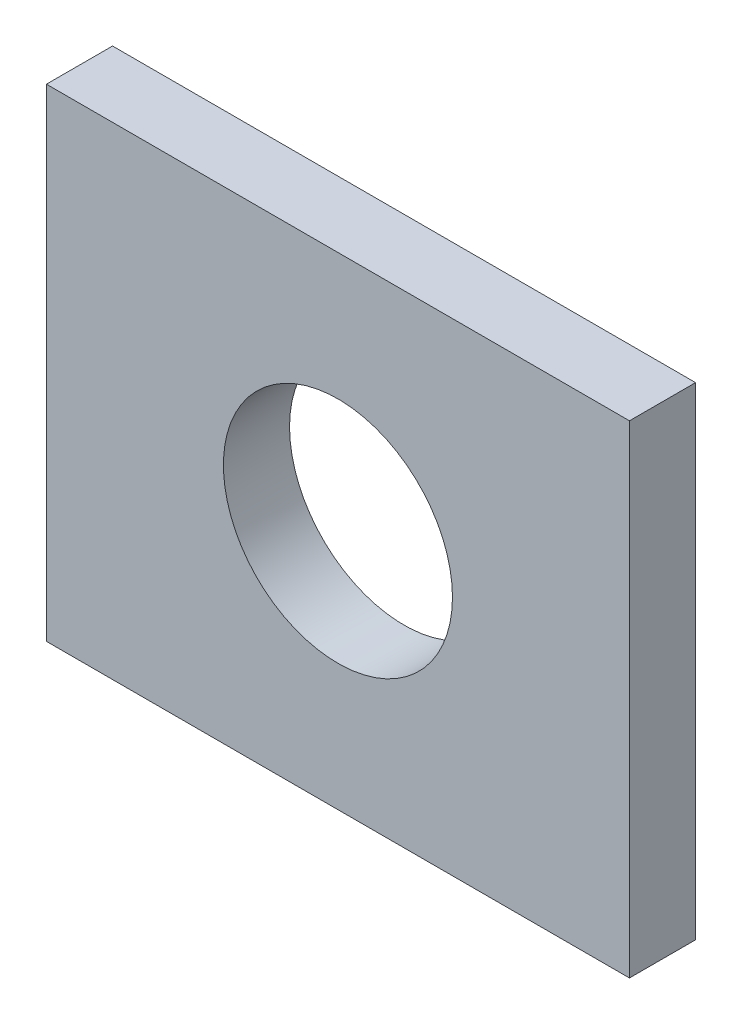
ISO-10303-21;
HEADER;
FILE_DESCRIPTION(('STEP AP214'),'2;1');
FILE_NAME('part.step','',(''),(''),'','','');
FILE_SCHEMA(('AUTOMOTIVE_DESIGN { 1 0 10303 214 1 1 1 1 }'));
ENDSEC;
DATA;
#1=APPLICATION_CONTEXT('core data for automotive mechanical design processes');
#2=APPLICATION_PROTOCOL_DEFINITION('international standard','automotive_design',2000,#1);
#3=PRODUCT_CONTEXT('',#1,'mechanical');
#4=PRODUCT('Part','Part','',(#3));
#5=PRODUCT_RELATED_PRODUCT_CATEGORY('part','',(#4));
#6=PRODUCT_DEFINITION_FORMATION('','',#4);
#7=PRODUCT_DEFINITION_CONTEXT('part definition',#1,'design');
#8=PRODUCT_DEFINITION('design','',#6,#7);
#9=PRODUCT_DEFINITION_SHAPE('','',#8);
#10=(LENGTH_UNIT() NAMED_UNIT(*) SI_UNIT(.MILLI.,.METRE.));
#11=(NAMED_UNIT(*) PLANE_ANGLE_UNIT() SI_UNIT($,.RADIAN.));
#12=(NAMED_UNIT(*) SI_UNIT($,.STERADIAN.) SOLID_ANGLE_UNIT());
#13=UNCERTAINTY_MEASURE_WITH_UNIT(LENGTH_MEASURE(1.E-05),#10,'distance_accuracy_value','');
#14=(GEOMETRIC_REPRESENTATION_CONTEXT(3) GLOBAL_UNCERTAINTY_ASSIGNED_CONTEXT((#13)) GLOBAL_UNIT_ASSIGNED_CONTEXT((#10,
#11,#12)) REPRESENTATION_CONTEXT('',''));
#15=CARTESIAN_POINT('',(0.,0.,0.));
#16=DIRECTION('',(0.,0.,1.));
#17=DIRECTION('',(1.,0.,0.));
#18=AXIS2_PLACEMENT_3D('',#15,#16,#17);
#19=CARTESIAN_POINT('',(-6.35,-6.35,6.35));
#20=DIRECTION('',(1.,0.,0.));
#21=DIRECTION('',(0.,0.,-1.));
#22=AXIS2_PLACEMENT_3D('',#19,#20,#21);
#23=PLANE('',#22);
#24=DIRECTION('',(0.,-1.,0.));
#25=VECTOR('',#24,1.);
#26=CARTESIAN_POINT('',(-6.35,-6.35,0.));
#27=LINE('',#26,#25);
#28=CARTESIAN_POINT('',(-6.35,40.,0.));
#29=VERTEX_POINT('',#28);
#30=CARTESIAN_POINT('',(-6.35,-6.35,0.));
#31=VERTEX_POINT('',#30);
#32=EDGE_CURVE('E96',#29,#31,#27,.T.);
#33=ORIENTED_EDGE('',*,*,#32,.T.);
#34=DIRECTION('',(0.,0.,-1.));
#35=VECTOR('',#34,1.);
#36=CARTESIAN_POINT('',(-6.35,-6.35,6.35));
#37=LINE('',#36,#35);
#38=CARTESIAN_POINT('',(-6.35,-6.35,6.35));
#39=VERTEX_POINT('',#38);
#40=EDGE_CURVE('E11',#39,#31,#37,.T.);
#41=ORIENTED_EDGE('',*,*,#40,.F.);
#42=DIRECTION('',(0.,-1.,0.));
#43=VECTOR('',#42,1.);
#44=CARTESIAN_POINT('',(-6.35,-6.35,6.35));
#45=LINE('',#44,#43);
#46=CARTESIAN_POINT('',(-6.35,40.,6.35));
#47=VERTEX_POINT('',#46);
#48=EDGE_CURVE('E84',#47,#39,#45,.T.);
#49=ORIENTED_EDGE('',*,*,#48,.F.);
#50=DIRECTION('',(0.,0.,-1.));
#51=VECTOR('',#50,1.);
#52=CARTESIAN_POINT('',(-6.35,40.,6.35));
#53=LINE('',#52,#51);
#54=EDGE_CURVE('E92',#47,#29,#53,.T.);
#55=ORIENTED_EDGE('',*,*,#54,.T.);
#56=EDGE_LOOP('',(#33,#41,#49,#55));
#57=FACE_BOUND('',#56,.T.);
#58=ADVANCED_FACE('F33',(#57),#23,.F.);
#59=CARTESIAN_POINT('',(-6.35,-6.35,6.35));
#60=DIRECTION('',(0.,1.,0.));
#61=DIRECTION('',(0.,0.,1.));
#62=AXIS2_PLACEMENT_3D('',#59,#60,#61);
#63=PLANE('',#62);
#64=DIRECTION('',(1.,0.,0.));
#65=VECTOR('',#64,1.);
#66=CARTESIAN_POINT('',(-6.35,-6.35,0.));
#67=LINE('',#66,#65);
#68=CARTESIAN_POINT('',(49.65,-6.35,0.));
#69=VERTEX_POINT('',#68);
#70=EDGE_CURVE('E88',#31,#69,#67,.T.);
#71=ORIENTED_EDGE('',*,*,#70,.T.);
#72=DIRECTION('',(0.,0.,-1.));
#73=VECTOR('',#72,1.);
#74=CARTESIAN_POINT('',(49.65,-6.35,6.35));
#75=LINE('',#74,#73);
#76=CARTESIAN_POINT('',(49.65,-6.35,6.35));
#77=VERTEX_POINT('',#76);
#78=EDGE_CURVE('E41',#77,#69,#75,.T.);
#79=ORIENTED_EDGE('',*,*,#78,.F.);
#80=DIRECTION('',(1.,0.,0.));
#81=VECTOR('',#80,1.);
#82=CARTESIAN_POINT('',(-6.35,-6.35,6.35));
#83=LINE('',#82,#81);
#84=EDGE_CURVE('E79',#39,#77,#83,.T.);
#85=ORIENTED_EDGE('',*,*,#84,.F.);
#86=ORIENTED_EDGE('',*,*,#40,.T.);
#87=EDGE_LOOP('',(#71,#79,#85,#86));
#88=FACE_BOUND('',#87,.T.);
#89=ADVANCED_FACE('F87',(#88),#63,.F.);
#90=CARTESIAN_POINT('',(49.65,-6.35,6.35));
#91=DIRECTION('',(-1.,0.,0.));
#92=DIRECTION('',(0.,0.,1.));
#93=AXIS2_PLACEMENT_3D('',#90,#91,#92);
#94=PLANE('',#93);
#95=DIRECTION('',(0.,1.,0.));
#96=VECTOR('',#95,1.);
#97=CARTESIAN_POINT('',(49.65,-6.35,0.));
#98=LINE('',#97,#96);
#99=CARTESIAN_POINT('',(49.65,40.,0.));
#100=VERTEX_POINT('',#99);
#101=EDGE_CURVE('E66',#69,#100,#98,.T.);
#102=ORIENTED_EDGE('',*,*,#101,.T.);
#103=DIRECTION('',(0.,0.,-1.));
#104=VECTOR('',#103,1.);
#105=CARTESIAN_POINT('',(49.65,40.,6.35));
#106=LINE('',#105,#104);
#107=CARTESIAN_POINT('',(49.65,40.,6.35));
#108=VERTEX_POINT('',#107);
#109=EDGE_CURVE('E89',#108,#100,#106,.T.);
#110=ORIENTED_EDGE('',*,*,#109,.F.);
#111=DIRECTION('',(0.,1.,0.));
#112=VECTOR('',#111,1.);
#113=CARTESIAN_POINT('',(49.65,-6.35,6.35));
#114=LINE('',#113,#112);
#115=EDGE_CURVE('E82',#77,#108,#114,.T.);
#116=ORIENTED_EDGE('',*,*,#115,.F.);
#117=ORIENTED_EDGE('',*,*,#78,.T.);
#118=EDGE_LOOP('',(#102,#110,#116,#117));
#119=FACE_BOUND('',#118,.T.);
#120=ADVANCED_FACE('F90',(#119),#94,.F.);
#121=CARTESIAN_POINT('',(-6.35,40.,6.35));
#122=DIRECTION('',(0.,-1.,0.));
#123=DIRECTION('',(0.,0.,-1.));
#124=AXIS2_PLACEMENT_3D('',#121,#122,#123);
#125=PLANE('',#124);
#126=DIRECTION('',(-1.,0.,0.));
#127=VECTOR('',#126,1.);
#128=CARTESIAN_POINT('',(-6.35,40.,0.));
#129=LINE('',#128,#127);
#130=EDGE_CURVE('E72',#100,#29,#129,.T.);
#131=ORIENTED_EDGE('',*,*,#130,.T.);
#132=ORIENTED_EDGE('',*,*,#54,.F.);
#133=DIRECTION('',(-1.,0.,0.));
#134=VECTOR('',#133,1.);
#135=CARTESIAN_POINT('',(-6.35,40.,6.35));
#136=LINE('',#135,#134);
#137=EDGE_CURVE('E49',#108,#47,#136,.T.);
#138=ORIENTED_EDGE('',*,*,#137,.F.);
#139=ORIENTED_EDGE('',*,*,#109,.T.);
#140=EDGE_LOOP('',(#131,#132,#138,#139));
#141=FACE_BOUND('',#140,.T.);
#142=ADVANCED_FACE('F104',(#141),#125,.F.);
#143=CARTESIAN_POINT('',(0.,0.,6.35));
#144=DIRECTION('',(0.,0.,-1.));
#145=DIRECTION('',(-1.,0.,0.));
#146=AXIS2_PLACEMENT_3D('',#143,#144,#145);
#147=PLANE('',#146);
#148=CARTESIAN_POINT('',(21.65,16.825,6.35));
#149=DIRECTION('',(0.,0.,1.));
#150=DIRECTION('',(1.,0.,0.));
#151=AXIS2_PLACEMENT_3D('',#148,#149,#150);
#152=CIRCLE('',#151,11.);
#153=CARTESIAN_POINT('',(32.65,16.825,6.35));
#154=VERTEX_POINT('',#153);
#155=EDGE_CURVE('E99',#154,#154,#152,.T.);
#156=ORIENTED_EDGE('',*,*,#155,.F.);
#157=EDGE_LOOP('',(#156));
#158=FACE_BOUND('',#157,.T.);
#159=ORIENTED_EDGE('',*,*,#48,.T.);
#160=ORIENTED_EDGE('',*,*,#84,.T.);
#161=ORIENTED_EDGE('',*,*,#115,.T.);
#162=ORIENTED_EDGE('',*,*,#137,.T.);
#163=EDGE_LOOP('',(#159,#160,#161,#162));
#164=FACE_BOUND('',#163,.T.);
#165=ADVANCED_FACE('F80',(#158,#164),#147,.F.);
#166=CARTESIAN_POINT('',(0.,0.,0.));
#167=DIRECTION('',(0.,0.,-1.));
#168=DIRECTION('',(-1.,0.,0.));
#169=AXIS2_PLACEMENT_3D('',#166,#167,#168);
#170=PLANE('',#169);
#171=CARTESIAN_POINT('',(21.65,16.825,0.));
#172=DIRECTION('',(0.,0.,-1.));
#173=DIRECTION('',(-1.,0.,0.));
#174=AXIS2_PLACEMENT_3D('',#171,#172,#173);
#175=CIRCLE('',#174,11.);
#176=CARTESIAN_POINT('',(10.65,16.825,0.));
#177=VERTEX_POINT('',#176);
#178=EDGE_CURVE('E110',#177,#177,#175,.F.);
#179=ORIENTED_EDGE('',*,*,#178,.T.);
#180=EDGE_LOOP('',(#179));
#181=FACE_BOUND('',#180,.T.);
#182=ORIENTED_EDGE('',*,*,#32,.F.);
#183=ORIENTED_EDGE('',*,*,#130,.F.);
#184=ORIENTED_EDGE('',*,*,#101,.F.);
#185=ORIENTED_EDGE('',*,*,#70,.F.);
#186=EDGE_LOOP('',(#182,#183,#184,#185));
#187=FACE_BOUND('',#186,.T.);
#188=ADVANCED_FACE('F107',(#181,#187),#170,.T.);
#189=CARTESIAN_POINT('',(21.65,16.825,-0.00100000000000013));
#190=DIRECTION('',(0.,0.,1.));
#191=DIRECTION('',(1.,0.,0.));
#192=AXIS2_PLACEMENT_3D('',#189,#190,#191);
#193=CYLINDRICAL_SURFACE('',#192,11.);
#194=ORIENTED_EDGE('',*,*,#178,.F.);
#195=EDGE_LOOP('',(#194));
#196=FACE_BOUND('',#195,.T.);
#197=ORIENTED_EDGE('',*,*,#155,.T.);
#198=EDGE_LOOP('',(#197));
#199=FACE_BOUND('',#198,.T.);
#200=ADVANCED_FACE('F116',(#196,#199),#193,.F.);
#201=CLOSED_SHELL('',(#58,#89,#120,#142,#165,#188,#200));
#202=MANIFOLD_SOLID_BREP('B2',#201);
#203=ADVANCED_BREP_SHAPE_REPRESENTATION('',(#18,#202),#14);
#204=SHAPE_DEFINITION_REPRESENTATION(#9,#203);
ENDSEC;
END-ISO-10303-21;
